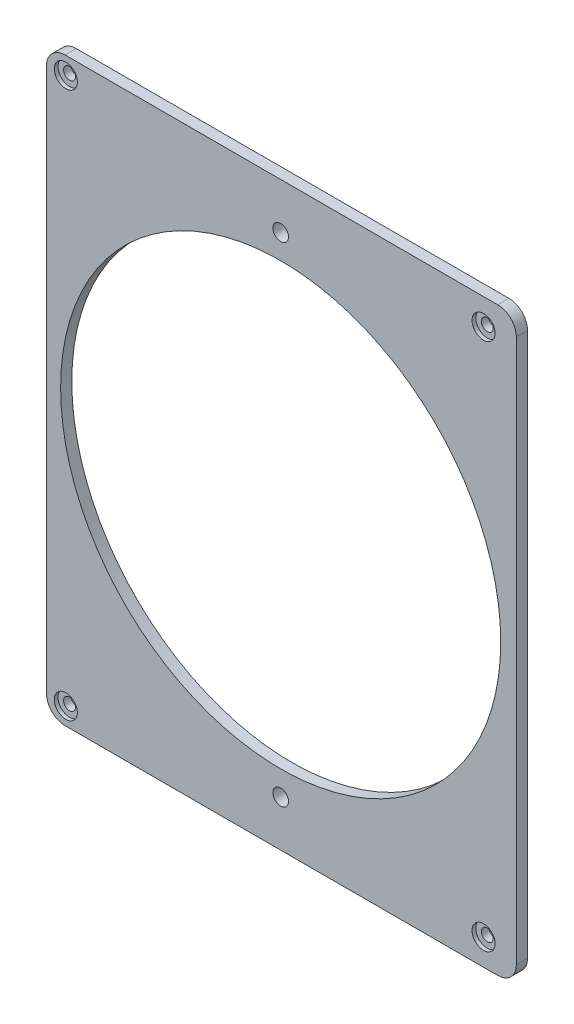
ISO-10303-21;
HEADER;
FILE_DESCRIPTION(('STEP AP214'),'2;1');
FILE_NAME('part.step','',(''),(''),'','','');
FILE_SCHEMA(('AUTOMOTIVE_DESIGN { 1 0 10303 214 1 1 1 1 }'));
ENDSEC;
DATA;
#1=APPLICATION_CONTEXT('core data for automotive mechanical design processes');
#2=APPLICATION_PROTOCOL_DEFINITION('international standard','automotive_design',2000,#1);
#3=PRODUCT_CONTEXT('',#1,'mechanical');
#4=PRODUCT('Part','Part','',(#3));
#5=PRODUCT_RELATED_PRODUCT_CATEGORY('part','',(#4));
#6=PRODUCT_DEFINITION_FORMATION('','',#4);
#7=PRODUCT_DEFINITION_CONTEXT('part definition',#1,'design');
#8=PRODUCT_DEFINITION('design','',#6,#7);
#9=PRODUCT_DEFINITION_SHAPE('','',#8);
#10=(LENGTH_UNIT() NAMED_UNIT(*) SI_UNIT(.MILLI.,.METRE.));
#11=(NAMED_UNIT(*) PLANE_ANGLE_UNIT() SI_UNIT($,.RADIAN.));
#12=(NAMED_UNIT(*) SI_UNIT($,.STERADIAN.) SOLID_ANGLE_UNIT());
#13=UNCERTAINTY_MEASURE_WITH_UNIT(LENGTH_MEASURE(1.E-05),#10,'distance_accuracy_value','');
#14=(GEOMETRIC_REPRESENTATION_CONTEXT(3) GLOBAL_UNCERTAINTY_ASSIGNED_CONTEXT((#13)) GLOBAL_UNIT_ASSIGNED_CONTEXT((#10,
#11,#12)) REPRESENTATION_CONTEXT('',''));
#15=CARTESIAN_POINT('',(0.,0.,0.));
#16=DIRECTION('',(0.,0.,1.));
#17=DIRECTION('',(1.,0.,0.));
#18=AXIS2_PLACEMENT_3D('',#15,#16,#17);
#19=CARTESIAN_POINT('',(58.4934425788602,-70.9643370582062,3.));
#20=DIRECTION('',(0.,0.,-1.));
#21=DIRECTION('',(-1.,0.,0.));
#22=AXIS2_PLACEMENT_3D('',#19,#20,#21);
#23=CYLINDRICAL_SURFACE('',#22,1.59999999999802);
#24=CARTESIAN_POINT('',(58.4934425788602,-70.9643370582062,0.));
#25=DIRECTION('',(0.,0.,1.));
#26=DIRECTION('',(-1.,0.,0.));
#27=AXIS2_PLACEMENT_3D('',#24,#25,#26);
#28=CIRCLE('',#27,1.59999999999802);
#29=CARTESIAN_POINT('',(56.8934425788622,-70.9643370582062,0.));
#30=VERTEX_POINT('',#29);
#31=EDGE_CURVE('E231',#30,#30,#28,.T.);
#32=ORIENTED_EDGE('',*,*,#31,.F.);
#33=EDGE_LOOP('',(#32));
#34=FACE_BOUND('',#33,.T.);
#35=CARTESIAN_POINT('',(58.4934425788602,-70.9643370582062,2.));
#36=DIRECTION('',(0.,0.,1.));
#37=DIRECTION('',(1.,0.,0.));
#38=AXIS2_PLACEMENT_3D('',#35,#36,#37);
#39=CIRCLE('',#38,1.59999999999802);
#40=CARTESIAN_POINT('',(60.0934425788583,-70.9643370582062,2.));
#41=VERTEX_POINT('',#40);
#42=EDGE_CURVE('E197',#41,#41,#39,.T.);
#43=ORIENTED_EDGE('',*,*,#42,.T.);
#44=EDGE_LOOP('',(#43));
#45=FACE_BOUND('',#44,.T.);
#46=ADVANCED_FACE('F43',(#34,#45),#23,.F.);
#47=CARTESIAN_POINT('',(-53.7050082180734,-73.3482193616655,3.));
#48=DIRECTION('',(0.,0.,-1.));
#49=DIRECTION('',(-1.,0.,0.));
#50=AXIS2_PLACEMENT_3D('',#47,#48,#49);
#51=CYLINDRICAL_SURFACE('',#50,1.59999999999705);
#52=CARTESIAN_POINT('',(-53.7050082180734,-73.3482193616655,0.));
#53=DIRECTION('',(0.,0.,1.));
#54=DIRECTION('',(-1.,0.,0.));
#55=AXIS2_PLACEMENT_3D('',#52,#53,#54);
#56=CIRCLE('',#55,1.59999999999705);
#57=CARTESIAN_POINT('',(-55.3050082180705,-73.3482193616655,0.));
#58=VERTEX_POINT('',#57);
#59=EDGE_CURVE('E222',#58,#58,#56,.T.);
#60=ORIENTED_EDGE('',*,*,#59,.F.);
#61=EDGE_LOOP('',(#60));
#62=FACE_BOUND('',#61,.T.);
#63=CARTESIAN_POINT('',(-53.7050082180734,-73.3482193616655,2.));
#64=DIRECTION('',(0.,0.,1.));
#65=DIRECTION('',(1.,0.,0.));
#66=AXIS2_PLACEMENT_3D('',#63,#64,#65);
#67=CIRCLE('',#66,1.59999999999705);
#68=CARTESIAN_POINT('',(-52.1050082180764,-73.3482193616655,2.));
#69=VERTEX_POINT('',#68);
#70=EDGE_CURVE('E189',#69,#69,#67,.T.);
#71=ORIENTED_EDGE('',*,*,#70,.T.);
#72=EDGE_LOOP('',(#71));
#73=FACE_BOUND('',#72,.T.);
#74=ADVANCED_FACE('F293',(#62,#73),#51,.F.);
#75=CARTESIAN_POINT('',(62.2999999999999,-72.9999999999999,3.));
#76=DIRECTION('',(0.,0.,-1.));
#77=DIRECTION('',(-1.,0.,0.));
#78=AXIS2_PLACEMENT_3D('',#75,#76,#77);
#79=PLANE('',#78);
#80=CARTESIAN_POINT('',(58.4934425788602,70.9643370582062,3.));
#81=DIRECTION('',(0.,0.,1.));
#82=DIRECTION('',(-1.,0.,0.));
#83=AXIS2_PLACEMENT_3D('',#80,#81,#82);
#84=CIRCLE('',#83,3.10000000001108);
#85=CARTESIAN_POINT('',(55.3934425788491,70.9643370582062,3.));
#86=VERTEX_POINT('',#85);
#87=EDGE_CURVE('E259',#86,#86,#84,.T.);
#88=ORIENTED_EDGE('',*,*,#87,.F.);
#89=EDGE_LOOP('',(#88));
#90=FACE_BOUND('',#89,.T.);
#91=CARTESIAN_POINT('',(-53.7050082180734,73.3482193616655,3.));
#92=DIRECTION('',(0.,0.,1.));
#93=DIRECTION('',(-1.,0.,0.));
#94=AXIS2_PLACEMENT_3D('',#91,#92,#93);
#95=CIRCLE('',#94,3.10000000000686);
#96=CARTESIAN_POINT('',(-56.8050082180803,73.3482193616655,3.));
#97=VERTEX_POINT('',#96);
#98=EDGE_CURVE('E264',#97,#97,#95,.T.);
#99=ORIENTED_EDGE('',*,*,#98,.F.);
#100=EDGE_LOOP('',(#99));
#101=FACE_BOUND('',#100,.T.);
#102=CARTESIAN_POINT('',(-53.7050082180734,-73.3482193616655,3.));
#103=DIRECTION('',(0.,0.,1.));
#104=DIRECTION('',(1.,0.,0.));
#105=AXIS2_PLACEMENT_3D('',#102,#103,#104);
#106=CIRCLE('',#105,3.1);
#107=CARTESIAN_POINT('',(-50.6050082180734,-73.3482193616655,3.));
#108=VERTEX_POINT('',#107);
#109=EDGE_CURVE('E272',#108,#108,#106,.T.);
#110=ORIENTED_EDGE('',*,*,#109,.F.);
#111=EDGE_LOOP('',(#110));
#112=FACE_BOUND('',#111,.T.);
#113=CARTESIAN_POINT('',(58.4934425788602,-70.9643370582062,3.));
#114=DIRECTION('',(0.,0.,1.));
#115=DIRECTION('',(1.,0.,0.));
#116=AXIS2_PLACEMENT_3D('',#113,#114,#115);
#117=CIRCLE('',#116,3.1);
#118=CARTESIAN_POINT('',(61.5934425788602,-70.9643370582062,3.));
#119=VERTEX_POINT('',#118);
#120=EDGE_CURVE('E270',#119,#119,#117,.T.);
#121=ORIENTED_EDGE('',*,*,#120,.F.);
#122=EDGE_LOOP('',(#121));
#123=FACE_BOUND('',#122,.T.);
#124=CARTESIAN_POINT('',(3.99999999999862,-65.6499999999991,3.));
#125=DIRECTION('',(0.,0.,1.));
#126=DIRECTION('',(1.,0.,0.));
#127=AXIS2_PLACEMENT_3D('',#124,#125,#126);
#128=CIRCLE('',#127,2.1);
#129=CARTESIAN_POINT('',(6.09999999999862,-65.6499999999991,3.));
#130=VERTEX_POINT('',#129);
#131=EDGE_CURVE('E218',#130,#130,#128,.T.);
#132=ORIENTED_EDGE('',*,*,#131,.F.);
#133=EDGE_LOOP('',(#132));
#134=FACE_BOUND('',#133,.T.);
#135=CARTESIAN_POINT('',(3.99999999999801,65.6500000000009,3.));
#136=DIRECTION('',(0.,0.,1.));
#137=DIRECTION('',(1.,0.,0.));
#138=AXIS2_PLACEMENT_3D('',#135,#136,#137);
#139=CIRCLE('',#138,2.1);
#140=CARTESIAN_POINT('',(6.099999999998,65.6500000000009,3.));
#141=VERTEX_POINT('',#140);
#142=EDGE_CURVE('E211',#141,#141,#139,.T.);
#143=ORIENTED_EDGE('',*,*,#142,.F.);
#144=EDGE_LOOP('',(#143));
#145=FACE_BOUND('',#144,.T.);
#146=CARTESIAN_POINT('',(62.2999999999999,-72.9999999999999,3.));
#147=DIRECTION('',(0.,0.,1.));
#148=DIRECTION('',(-1.,0.,0.));
#149=AXIS2_PLACEMENT_3D('',#146,#147,#148);
#150=CIRCLE('',#149,5.00000000000009);
#151=CARTESIAN_POINT('',(62.2999999999999,-78.0000000000001,3.));
#152=VERTEX_POINT('',#151);
#153=CARTESIAN_POINT('',(67.3,-72.9999999999951,3.));
#154=VERTEX_POINT('',#153);
#155=EDGE_CURVE('E172',#152,#154,#150,.T.);
#156=ORIENTED_EDGE('',*,*,#155,.T.);
#157=DIRECTION('',(0.,1.,0.));
#158=VECTOR('',#157,1.);
#159=CARTESIAN_POINT('',(67.3,-72.9999999999951,3.));
#160=LINE('',#159,#158);
#161=CARTESIAN_POINT('',(67.3,72.9999999999951,3.));
#162=VERTEX_POINT('',#161);
#163=EDGE_CURVE('E106',#154,#162,#160,.T.);
#164=ORIENTED_EDGE('',*,*,#163,.T.);
#165=CARTESIAN_POINT('',(62.2999999999999,72.9999999999951,3.));
#166=DIRECTION('',(0.,0.,1.));
#167=DIRECTION('',(1.,0.,0.));
#168=AXIS2_PLACEMENT_3D('',#165,#166,#167);
#169=CIRCLE('',#168,5.00000000000002);
#170=CARTESIAN_POINT('',(62.2999999999999,77.9999999999951,3.));
#171=VERTEX_POINT('',#170);
#172=EDGE_CURVE('E249',#162,#171,#169,.T.);
#173=ORIENTED_EDGE('',*,*,#172,.T.);
#174=DIRECTION('',(-1.,0.,0.));
#175=VECTOR('',#174,1.);
#176=CARTESIAN_POINT('',(62.2999999999999,77.9999999999951,3.));
#177=LINE('',#176,#175);
#178=CARTESIAN_POINT('',(-53.9000000000051,77.9999999999951,3.));
#179=VERTEX_POINT('',#178);
#180=EDGE_CURVE('E252',#171,#179,#177,.T.);
#181=ORIENTED_EDGE('',*,*,#180,.T.);
#182=CARTESIAN_POINT('',(-53.9000000000051,73.,3.));
#183=DIRECTION('',(0.,0.,1.));
#184=DIRECTION('',(1.,0.,0.));
#185=AXIS2_PLACEMENT_3D('',#182,#183,#184);
#186=CIRCLE('',#185,4.99999999999506);
#187=CARTESIAN_POINT('',(-58.9000000000001,73.,3.));
#188=VERTEX_POINT('',#187);
#189=EDGE_CURVE('E126',#179,#188,#186,.T.);
#190=ORIENTED_EDGE('',*,*,#189,.T.);
#191=DIRECTION('',(0.,-1.,0.));
#192=VECTOR('',#191,1.);
#193=CARTESIAN_POINT('',(-58.9000000000001,-73.,3.));
#194=LINE('',#193,#192);
#195=CARTESIAN_POINT('',(-58.9000000000001,-73.,3.));
#196=VERTEX_POINT('',#195);
#197=EDGE_CURVE('E119',#188,#196,#194,.T.);
#198=ORIENTED_EDGE('',*,*,#197,.T.);
#199=CARTESIAN_POINT('',(-53.9,-73.,3.));
#200=DIRECTION('',(0.,0.,1.));
#201=DIRECTION('',(-1.,0.,0.));
#202=AXIS2_PLACEMENT_3D('',#199,#200,#201);
#203=CIRCLE('',#202,5.0000000000001);
#204=CARTESIAN_POINT('',(-53.9,-78.0000000000001,3.));
#205=VERTEX_POINT('',#204);
#206=EDGE_CURVE('E124',#196,#205,#203,.T.);
#207=ORIENTED_EDGE('',*,*,#206,.T.);
#208=DIRECTION('',(1.,0.,0.));
#209=VECTOR('',#208,1.);
#210=CARTESIAN_POINT('',(62.2999999999999,-78.0000000000001,3.));
#211=LINE('',#210,#209);
#212=EDGE_CURVE('E63',#205,#152,#211,.T.);
#213=ORIENTED_EDGE('',*,*,#212,.T.);
#214=EDGE_LOOP('',(#156,#164,#173,#181,#190,#198,#207,#213));
#215=FACE_BOUND('',#214,.T.);
#216=CARTESIAN_POINT('',(3.99999999999867,8.87431154202782E-13,3.));
#217=DIRECTION('',(0.,0.,1.));
#218=DIRECTION('',(1.,0.,0.));
#219=AXIS2_PLACEMENT_3D('',#216,#217,#218);
#220=CIRCLE('',#219,59.1);
#221=CARTESIAN_POINT('',(63.0999999999987,8.87431154202782E-13,3.));
#222=VERTEX_POINT('',#221);
#223=EDGE_CURVE('E154',#222,#222,#220,.T.);
#224=ORIENTED_EDGE('',*,*,#223,.F.);
#225=EDGE_LOOP('',(#224));
#226=FACE_BOUND('',#225,.T.);
#227=ADVANCED_FACE('F121',(#90,#101,#112,#123,#134,#145,#215,#226),#79,.F.);
#228=CARTESIAN_POINT('',(62.2999999999999,-72.9999999999999,0.));
#229=DIRECTION('',(0.,0.,-1.));
#230=DIRECTION('',(-1.,0.,0.));
#231=AXIS2_PLACEMENT_3D('',#228,#229,#230);
#232=PLANE('',#231);
#233=CARTESIAN_POINT('',(3.99999999999862,-65.6499999999991,0.));
#234=DIRECTION('',(0.,0.,1.));
#235=DIRECTION('',(1.,0.,0.));
#236=AXIS2_PLACEMENT_3D('',#233,#234,#235);
#237=CIRCLE('',#236,2.1);
#238=CARTESIAN_POINT('',(6.09999999999862,-65.6499999999991,0.));
#239=VERTEX_POINT('',#238);
#240=EDGE_CURVE('E227',#239,#239,#237,.T.);
#241=ORIENTED_EDGE('',*,*,#240,.T.);
#242=EDGE_LOOP('',(#241));
#243=FACE_BOUND('',#242,.T.);
#244=CARTESIAN_POINT('',(3.99999999999801,65.6500000000009,0.));
#245=DIRECTION('',(0.,0.,1.));
#246=DIRECTION('',(1.,0.,0.));
#247=AXIS2_PLACEMENT_3D('',#244,#245,#246);
#248=CIRCLE('',#247,2.1);
#249=CARTESIAN_POINT('',(6.099999999998,65.6500000000009,0.));
#250=VERTEX_POINT('',#249);
#251=EDGE_CURVE('E205',#250,#250,#248,.T.);
#252=ORIENTED_EDGE('',*,*,#251,.T.);
#253=EDGE_LOOP('',(#252));
#254=FACE_BOUND('',#253,.T.);
#255=CARTESIAN_POINT('',(-53.7050082180734,73.3482193616655,0.));
#256=DIRECTION('',(0.,0.,1.));
#257=DIRECTION('',(1.,0.,0.));
#258=AXIS2_PLACEMENT_3D('',#255,#256,#257);
#259=CIRCLE('',#258,1.6);
#260=CARTESIAN_POINT('',(-52.1050082180734,73.3482193616655,0.));
#261=VERTEX_POINT('',#260);
#262=EDGE_CURVE('E226',#261,#261,#259,.T.);
#263=ORIENTED_EDGE('',*,*,#262,.T.);
#264=EDGE_LOOP('',(#263));
#265=FACE_BOUND('',#264,.T.);
#266=CARTESIAN_POINT('',(58.4934425788602,70.9643370582062,0.));
#267=DIRECTION('',(0.,0.,1.));
#268=DIRECTION('',(1.,0.,0.));
#269=AXIS2_PLACEMENT_3D('',#266,#267,#268);
#270=CIRCLE('',#269,1.6);
#271=CARTESIAN_POINT('',(60.0934425788602,70.9643370582062,0.));
#272=VERTEX_POINT('',#271);
#273=EDGE_CURVE('E235',#272,#272,#270,.T.);
#274=ORIENTED_EDGE('',*,*,#273,.T.);
#275=EDGE_LOOP('',(#274));
#276=FACE_BOUND('',#275,.T.);
#277=CARTESIAN_POINT('',(62.2999999999999,-72.9999999999999,0.));
#278=DIRECTION('',(0.,0.,1.));
#279=DIRECTION('',(-1.,0.,0.));
#280=AXIS2_PLACEMENT_3D('',#277,#278,#279);
#281=CIRCLE('',#280,5.00000000000009);
#282=CARTESIAN_POINT('',(62.2999999999999,-78.0000000000001,0.));
#283=VERTEX_POINT('',#282);
#284=CARTESIAN_POINT('',(67.3,-72.9999999999951,0.));
#285=VERTEX_POINT('',#284);
#286=EDGE_CURVE('E149',#283,#285,#281,.T.);
#287=ORIENTED_EDGE('',*,*,#286,.F.);
#288=DIRECTION('',(1.,0.,0.));
#289=VECTOR('',#288,1.);
#290=CARTESIAN_POINT('',(62.2999999999999,-78.0000000000001,0.));
#291=LINE('',#290,#289);
#292=CARTESIAN_POINT('',(-53.9,-78.0000000000001,0.));
#293=VERTEX_POINT('',#292);
#294=EDGE_CURVE('E98',#293,#283,#291,.T.);
#295=ORIENTED_EDGE('',*,*,#294,.F.);
#296=CARTESIAN_POINT('',(-53.9,-73.,0.));
#297=DIRECTION('',(0.,0.,1.));
#298=DIRECTION('',(-1.,0.,0.));
#299=AXIS2_PLACEMENT_3D('',#296,#297,#298);
#300=CIRCLE('',#299,5.0000000000001);
#301=CARTESIAN_POINT('',(-58.9000000000001,-73.,0.));
#302=VERTEX_POINT('',#301);
#303=EDGE_CURVE('E92',#302,#293,#300,.T.);
#304=ORIENTED_EDGE('',*,*,#303,.F.);
#305=DIRECTION('',(0.,-1.,0.));
#306=VECTOR('',#305,1.);
#307=CARTESIAN_POINT('',(-58.9000000000001,-73.,0.));
#308=LINE('',#307,#306);
#309=CARTESIAN_POINT('',(-58.9000000000001,73.,0.));
#310=VERTEX_POINT('',#309);
#311=EDGE_CURVE('E135',#310,#302,#308,.T.);
#312=ORIENTED_EDGE('',*,*,#311,.F.);
#313=CARTESIAN_POINT('',(-53.9000000000051,73.,0.));
#314=DIRECTION('',(0.,0.,1.));
#315=DIRECTION('',(1.,0.,0.));
#316=AXIS2_PLACEMENT_3D('',#313,#314,#315);
#317=CIRCLE('',#316,4.99999999999506);
#318=CARTESIAN_POINT('',(-53.9000000000051,77.9999999999951,0.));
#319=VERTEX_POINT('',#318);
#320=EDGE_CURVE('E163',#319,#310,#317,.T.);
#321=ORIENTED_EDGE('',*,*,#320,.F.);
#322=DIRECTION('',(-1.,0.,0.));
#323=VECTOR('',#322,1.);
#324=CARTESIAN_POINT('',(62.2999999999999,77.9999999999951,0.));
#325=LINE('',#324,#323);
#326=CARTESIAN_POINT('',(62.2999999999999,77.9999999999951,0.));
#327=VERTEX_POINT('',#326);
#328=EDGE_CURVE('E160',#327,#319,#325,.T.);
#329=ORIENTED_EDGE('',*,*,#328,.F.);
#330=CARTESIAN_POINT('',(62.2999999999999,72.9999999999951,0.));
#331=DIRECTION('',(0.,0.,1.));
#332=DIRECTION('',(1.,0.,0.));
#333=AXIS2_PLACEMENT_3D('',#330,#331,#332);
#334=CIRCLE('',#333,5.00000000000002);
#335=CARTESIAN_POINT('',(67.3,72.9999999999951,0.));
#336=VERTEX_POINT('',#335);
#337=EDGE_CURVE('E157',#336,#327,#334,.T.);
#338=ORIENTED_EDGE('',*,*,#337,.F.);
#339=DIRECTION('',(0.,1.,0.));
#340=VECTOR('',#339,1.);
#341=CARTESIAN_POINT('',(67.3,-72.9999999999951,0.));
#342=LINE('',#341,#340);
#343=EDGE_CURVE('E153',#285,#336,#342,.T.);
#344=ORIENTED_EDGE('',*,*,#343,.F.);
#345=EDGE_LOOP('',(#287,#295,#304,#312,#321,#329,#338,#344));
#346=FACE_BOUND('',#345,.T.);
#347=CARTESIAN_POINT('',(3.99999999999867,8.87431154202782E-13,0.));
#348=DIRECTION('',(0.,0.,1.));
#349=DIRECTION('',(1.,0.,0.));
#350=AXIS2_PLACEMENT_3D('',#347,#348,#349);
#351=CIRCLE('',#350,59.1);
#352=CARTESIAN_POINT('',(63.0999999999987,8.87431154202782E-13,0.));
#353=VERTEX_POINT('',#352);
#354=EDGE_CURVE('E239',#353,#353,#351,.T.);
#355=ORIENTED_EDGE('',*,*,#354,.T.);
#356=EDGE_LOOP('',(#355));
#357=FACE_BOUND('',#356,.T.);
#358=ORIENTED_EDGE('',*,*,#31,.T.);
#359=EDGE_LOOP('',(#358));
#360=FACE_BOUND('',#359,.T.);
#361=ORIENTED_EDGE('',*,*,#59,.T.);
#362=EDGE_LOOP('',(#361));
#363=FACE_BOUND('',#362,.T.);
#364=ADVANCED_FACE('F292',(#243,#254,#265,#276,#346,#357,#360,#363),#232,.T.);
#365=CARTESIAN_POINT('',(62.2999999999999,-72.9999999999999,3.));
#366=DIRECTION('',(0.,0.,-1.));
#367=DIRECTION('',(-1.,0.,0.));
#368=AXIS2_PLACEMENT_3D('',#365,#366,#367);
#369=CYLINDRICAL_SURFACE('',#368,5.00000000000009);
#370=ORIENTED_EDGE('',*,*,#286,.T.);
#371=DIRECTION('',(0.,0.,-1.));
#372=VECTOR('',#371,1.);
#373=CARTESIAN_POINT('',(67.3,-72.9999999999951,3.));
#374=LINE('',#373,#372);
#375=EDGE_CURVE('E11',#154,#285,#374,.T.);
#376=ORIENTED_EDGE('',*,*,#375,.F.);
#377=ORIENTED_EDGE('',*,*,#155,.F.);
#378=DIRECTION('',(0.,0.,-1.));
#379=VECTOR('',#378,1.);
#380=CARTESIAN_POINT('',(62.2999999999999,-78.0000000000001,3.));
#381=LINE('',#380,#379);
#382=EDGE_CURVE('E145',#152,#283,#381,.T.);
#383=ORIENTED_EDGE('',*,*,#382,.T.);
#384=EDGE_LOOP('',(#370,#376,#377,#383));
#385=FACE_BOUND('',#384,.T.);
#386=ADVANCED_FACE('F45',(#385),#369,.T.);
#387=CARTESIAN_POINT('',(67.3,-72.9999999999951,3.));
#388=DIRECTION('',(-1.,0.,0.));
#389=DIRECTION('',(0.,-1.,0.));
#390=AXIS2_PLACEMENT_3D('',#387,#388,#389);
#391=PLANE('',#390);
#392=ORIENTED_EDGE('',*,*,#343,.T.);
#393=DIRECTION('',(0.,0.,-1.));
#394=VECTOR('',#393,1.);
#395=CARTESIAN_POINT('',(67.3,72.9999999999951,3.));
#396=LINE('',#395,#394);
#397=EDGE_CURVE('E54',#162,#336,#396,.T.);
#398=ORIENTED_EDGE('',*,*,#397,.F.);
#399=ORIENTED_EDGE('',*,*,#163,.F.);
#400=ORIENTED_EDGE('',*,*,#375,.T.);
#401=EDGE_LOOP('',(#392,#398,#399,#400));
#402=FACE_BOUND('',#401,.T.);
#403=ADVANCED_FACE('F348',(#402),#391,.F.);
#404=CARTESIAN_POINT('',(62.2999999999999,72.9999999999951,3.));
#405=DIRECTION('',(0.,0.,-1.));
#406=DIRECTION('',(-1.,0.,0.));
#407=AXIS2_PLACEMENT_3D('',#404,#405,#406);
#408=CYLINDRICAL_SURFACE('',#407,5.00000000000002);
#409=ORIENTED_EDGE('',*,*,#337,.T.);
#410=DIRECTION('',(0.,0.,-1.));
#411=VECTOR('',#410,1.);
#412=CARTESIAN_POINT('',(62.2999999999999,77.9999999999951,3.));
#413=LINE('',#412,#411);
#414=EDGE_CURVE('E183',#171,#327,#413,.T.);
#415=ORIENTED_EDGE('',*,*,#414,.F.);
#416=ORIENTED_EDGE('',*,*,#172,.F.);
#417=ORIENTED_EDGE('',*,*,#397,.T.);
#418=EDGE_LOOP('',(#409,#415,#416,#417));
#419=FACE_BOUND('',#418,.T.);
#420=ADVANCED_FACE('F345',(#419),#408,.T.);
#421=CARTESIAN_POINT('',(62.2999999999999,77.9999999999951,3.));
#422=DIRECTION('',(0.,-1.,0.));
#423=DIRECTION('',(1.,0.,0.));
#424=AXIS2_PLACEMENT_3D('',#421,#422,#423);
#425=PLANE('',#424);
#426=ORIENTED_EDGE('',*,*,#328,.T.);
#427=DIRECTION('',(0.,0.,-1.));
#428=VECTOR('',#427,1.);
#429=CARTESIAN_POINT('',(-53.9000000000051,77.9999999999951,3.));
#430=LINE('',#429,#428);
#431=EDGE_CURVE('E179',#179,#319,#430,.T.);
#432=ORIENTED_EDGE('',*,*,#431,.F.);
#433=ORIENTED_EDGE('',*,*,#180,.F.);
#434=ORIENTED_EDGE('',*,*,#414,.T.);
#435=EDGE_LOOP('',(#426,#432,#433,#434));
#436=FACE_BOUND('',#435,.T.);
#437=ADVANCED_FACE('F341',(#436),#425,.F.);
#438=CARTESIAN_POINT('',(-53.9000000000051,73.,3.));
#439=DIRECTION('',(0.,0.,-1.));
#440=DIRECTION('',(-1.,0.,0.));
#441=AXIS2_PLACEMENT_3D('',#438,#439,#440);
#442=CYLINDRICAL_SURFACE('',#441,4.99999999999506);
#443=ORIENTED_EDGE('',*,*,#320,.T.);
#444=DIRECTION('',(0.,0.,-1.));
#445=VECTOR('',#444,1.);
#446=CARTESIAN_POINT('',(-58.9000000000001,73.,3.));
#447=LINE('',#446,#445);
#448=EDGE_CURVE('E137',#188,#310,#447,.T.);
#449=ORIENTED_EDGE('',*,*,#448,.F.);
#450=ORIENTED_EDGE('',*,*,#189,.F.);
#451=ORIENTED_EDGE('',*,*,#431,.T.);
#452=EDGE_LOOP('',(#443,#449,#450,#451));
#453=FACE_BOUND('',#452,.T.);
#454=ADVANCED_FACE('F338',(#453),#442,.T.);
#455=CARTESIAN_POINT('',(-58.9000000000001,-73.,3.));
#456=DIRECTION('',(1.,0.,0.));
#457=DIRECTION('',(0.,0.,-1.));
#458=AXIS2_PLACEMENT_3D('',#455,#456,#457);
#459=PLANE('',#458);
#460=ORIENTED_EDGE('',*,*,#311,.T.);
#461=DIRECTION('',(0.,0.,-1.));
#462=VECTOR('',#461,1.);
#463=CARTESIAN_POINT('',(-58.9000000000001,-73.,3.));
#464=LINE('',#463,#462);
#465=EDGE_CURVE('E132',#196,#302,#464,.T.);
#466=ORIENTED_EDGE('',*,*,#465,.F.);
#467=ORIENTED_EDGE('',*,*,#197,.F.);
#468=ORIENTED_EDGE('',*,*,#448,.T.);
#469=EDGE_LOOP('',(#460,#466,#467,#468));
#470=FACE_BOUND('',#469,.T.);
#471=ADVANCED_FACE('F133',(#470),#459,.F.);
#472=CARTESIAN_POINT('',(-53.9,-73.,3.));
#473=DIRECTION('',(0.,0.,-1.));
#474=DIRECTION('',(-1.,0.,0.));
#475=AXIS2_PLACEMENT_3D('',#472,#473,#474);
#476=CYLINDRICAL_SURFACE('',#475,5.0000000000001);
#477=ORIENTED_EDGE('',*,*,#303,.T.);
#478=DIRECTION('',(0.,0.,-1.));
#479=VECTOR('',#478,1.);
#480=CARTESIAN_POINT('',(-53.9,-78.0000000000001,3.));
#481=LINE('',#480,#479);
#482=EDGE_CURVE('E138',#205,#293,#481,.T.);
#483=ORIENTED_EDGE('',*,*,#482,.F.);
#484=ORIENTED_EDGE('',*,*,#206,.F.);
#485=ORIENTED_EDGE('',*,*,#465,.T.);
#486=EDGE_LOOP('',(#477,#483,#484,#485));
#487=FACE_BOUND('',#486,.T.);
#488=ADVANCED_FACE('F140',(#487),#476,.T.);
#489=CARTESIAN_POINT('',(62.2999999999999,-78.0000000000001,3.));
#490=DIRECTION('',(0.,1.,0.));
#491=DIRECTION('',(-1.,0.,0.));
#492=AXIS2_PLACEMENT_3D('',#489,#490,#491);
#493=PLANE('',#492);
#494=ORIENTED_EDGE('',*,*,#294,.T.);
#495=ORIENTED_EDGE('',*,*,#382,.F.);
#496=ORIENTED_EDGE('',*,*,#212,.F.);
#497=ORIENTED_EDGE('',*,*,#482,.T.);
#498=EDGE_LOOP('',(#494,#495,#496,#497));
#499=FACE_BOUND('',#498,.T.);
#500=ADVANCED_FACE('F326',(#499),#493,.F.);
#501=CARTESIAN_POINT('',(3.99999999999867,8.87431154202782E-13,3.));
#502=DIRECTION('',(0.,0.,-1.));
#503=DIRECTION('',(-1.,0.,0.));
#504=AXIS2_PLACEMENT_3D('',#501,#502,#503);
#505=CYLINDRICAL_SURFACE('',#504,59.1);
#506=ORIENTED_EDGE('',*,*,#223,.T.);
#507=EDGE_LOOP('',(#506));
#508=FACE_BOUND('',#507,.T.);
#509=ORIENTED_EDGE('',*,*,#354,.F.);
#510=EDGE_LOOP('',(#509));
#511=FACE_BOUND('',#510,.T.);
#512=ADVANCED_FACE('F323',(#508,#511),#505,.F.);
#513=CARTESIAN_POINT('',(58.4934425788602,70.9643370582062,3.));
#514=DIRECTION('',(0.,0.,-1.));
#515=DIRECTION('',(-1.,0.,0.));
#516=AXIS2_PLACEMENT_3D('',#513,#514,#515);
#517=CYLINDRICAL_SURFACE('',#516,1.6);
#518=CARTESIAN_POINT('',(58.4934425788602,70.9643370582062,2.));
#519=DIRECTION('',(0.,0.,-1.));
#520=DIRECTION('',(-1.,0.,0.));
#521=AXIS2_PLACEMENT_3D('',#518,#519,#520);
#522=CIRCLE('',#521,1.6);
#523=CARTESIAN_POINT('',(56.8934425788602,70.9643370582062,2.));
#524=VERTEX_POINT('',#523);
#525=EDGE_CURVE('E47',#524,#524,#522,.T.);
#526=ORIENTED_EDGE('',*,*,#525,.F.);
#527=EDGE_LOOP('',(#526));
#528=FACE_BOUND('',#527,.T.);
#529=ORIENTED_EDGE('',*,*,#273,.F.);
#530=EDGE_LOOP('',(#529));
#531=FACE_BOUND('',#530,.T.);
#532=ADVANCED_FACE('F309',(#528,#531),#517,.F.);
#533=CARTESIAN_POINT('',(-53.7050082180734,73.3482193616655,3.));
#534=DIRECTION('',(0.,0.,-1.));
#535=DIRECTION('',(-1.,0.,0.));
#536=AXIS2_PLACEMENT_3D('',#533,#534,#535);
#537=CYLINDRICAL_SURFACE('',#536,1.6);
#538=CARTESIAN_POINT('',(-53.7050082180734,73.3482193616655,2.));
#539=DIRECTION('',(0.,0.,-1.));
#540=DIRECTION('',(-1.,0.,0.));
#541=AXIS2_PLACEMENT_3D('',#538,#539,#540);
#542=CIRCLE('',#541,1.6);
#543=CARTESIAN_POINT('',(-55.3050082180734,73.3482193616655,2.));
#544=VERTEX_POINT('',#543);
#545=EDGE_CURVE('E193',#544,#544,#542,.T.);
#546=ORIENTED_EDGE('',*,*,#545,.F.);
#547=EDGE_LOOP('',(#546));
#548=FACE_BOUND('',#547,.T.);
#549=ORIENTED_EDGE('',*,*,#262,.F.);
#550=EDGE_LOOP('',(#549));
#551=FACE_BOUND('',#550,.T.);
#552=ADVANCED_FACE('F300',(#548,#551),#537,.F.);
#553=CARTESIAN_POINT('',(3.99999999999801,65.6500000000009,0.));
#554=DIRECTION('',(0.,0.,1.));
#555=DIRECTION('',(1.,0.,0.));
#556=AXIS2_PLACEMENT_3D('',#553,#554,#555);
#557=CYLINDRICAL_SURFACE('',#556,2.1);
#558=ORIENTED_EDGE('',*,*,#251,.F.);
#559=EDGE_LOOP('',(#558));
#560=FACE_BOUND('',#559,.T.);
#561=ORIENTED_EDGE('',*,*,#142,.T.);
#562=EDGE_LOOP('',(#561));
#563=FACE_BOUND('',#562,.T.);
#564=ADVANCED_FACE('F298',(#560,#563),#557,.F.);
#565=CARTESIAN_POINT('',(3.99999999999862,-65.6499999999991,0.));
#566=DIRECTION('',(0.,0.,1.));
#567=DIRECTION('',(1.,0.,0.));
#568=AXIS2_PLACEMENT_3D('',#565,#566,#567);
#569=CYLINDRICAL_SURFACE('',#568,2.1);
#570=ORIENTED_EDGE('',*,*,#240,.F.);
#571=EDGE_LOOP('',(#570));
#572=FACE_BOUND('',#571,.T.);
#573=ORIENTED_EDGE('',*,*,#131,.T.);
#574=EDGE_LOOP('',(#573));
#575=FACE_BOUND('',#574,.T.);
#576=ADVANCED_FACE('F288',(#572,#575),#569,.F.);
#577=CARTESIAN_POINT('',(-53.7050082180734,-73.3482193616655,2.));
#578=DIRECTION('',(0.,0.,1.));
#579=DIRECTION('',(1.,0.,0.));
#580=AXIS2_PLACEMENT_3D('',#577,#578,#579);
#581=CYLINDRICAL_SURFACE('',#580,3.1);
#582=CARTESIAN_POINT('',(-53.7050082180734,-73.3482193616655,2.));
#583=DIRECTION('',(0.,0.,1.));
#584=DIRECTION('',(1.,0.,0.));
#585=AXIS2_PLACEMENT_3D('',#582,#583,#584);
#586=CIRCLE('',#585,3.1);
#587=CARTESIAN_POINT('',(-50.6050082180734,-73.3482193616655,2.));
#588=VERTEX_POINT('',#587);
#589=EDGE_CURVE('E267',#588,#588,#586,.T.);
#590=ORIENTED_EDGE('',*,*,#589,.F.);
#591=EDGE_LOOP('',(#590));
#592=FACE_BOUND('',#591,.T.);
#593=ORIENTED_EDGE('',*,*,#109,.T.);
#594=EDGE_LOOP('',(#593));
#595=FACE_BOUND('',#594,.T.);
#596=ADVANCED_FACE('F306',(#592,#595),#581,.F.);
#597=CARTESIAN_POINT('',(-53.7050082180734,-73.3482193616655,2.));
#598=DIRECTION('',(0.,0.,1.));
#599=DIRECTION('',(1.,0.,0.));
#600=AXIS2_PLACEMENT_3D('',#597,#598,#599);
#601=PLANE('',#600);
#602=ORIENTED_EDGE('',*,*,#70,.F.);
#603=EDGE_LOOP('',(#602));
#604=FACE_BOUND('',#603,.T.);
#605=ORIENTED_EDGE('',*,*,#589,.T.);
#606=EDGE_LOOP('',(#605));
#607=FACE_BOUND('',#606,.T.);
#608=ADVANCED_FACE('F373',(#604,#607),#601,.T.);
#609=CARTESIAN_POINT('',(-53.7050082180734,73.3482193616655,2.));
#610=DIRECTION('',(0.,0.,1.));
#611=DIRECTION('',(1.,0.,0.));
#612=AXIS2_PLACEMENT_3D('',#609,#610,#611);
#613=CYLINDRICAL_SURFACE('',#612,3.10000000000686);
#614=CARTESIAN_POINT('',(-53.7050082180734,73.3482193616655,2.));
#615=DIRECTION('',(0.,0.,1.));
#616=DIRECTION('',(-1.,0.,0.));
#617=AXIS2_PLACEMENT_3D('',#614,#615,#616);
#618=CIRCLE('',#617,3.10000000000686);
#619=CARTESIAN_POINT('',(-56.8050082180803,73.3482193616655,2.));
#620=VERTEX_POINT('',#619);
#621=EDGE_CURVE('E261',#620,#620,#618,.T.);
#622=ORIENTED_EDGE('',*,*,#621,.F.);
#623=EDGE_LOOP('',(#622));
#624=FACE_BOUND('',#623,.T.);
#625=ORIENTED_EDGE('',*,*,#98,.T.);
#626=EDGE_LOOP('',(#625));
#627=FACE_BOUND('',#626,.T.);
#628=ADVANCED_FACE('F376',(#624,#627),#613,.F.);
#629=CARTESIAN_POINT('',(-53.7050082180734,73.3482193616655,2.));
#630=DIRECTION('',(0.,0.,-1.));
#631=DIRECTION('',(-1.,0.,0.));
#632=AXIS2_PLACEMENT_3D('',#629,#630,#631);
#633=PLANE('',#632);
#634=ORIENTED_EDGE('',*,*,#545,.T.);
#635=EDGE_LOOP('',(#634));
#636=FACE_BOUND('',#635,.T.);
#637=ORIENTED_EDGE('',*,*,#621,.T.);
#638=EDGE_LOOP('',(#637));
#639=FACE_BOUND('',#638,.T.);
#640=ADVANCED_FACE('F400',(#636,#639),#633,.F.);
#641=CARTESIAN_POINT('',(58.4934425788602,-70.9643370582062,2.));
#642=DIRECTION('',(0.,0.,1.));
#643=DIRECTION('',(1.,0.,0.));
#644=AXIS2_PLACEMENT_3D('',#641,#642,#643);
#645=CYLINDRICAL_SURFACE('',#644,3.1);
#646=CARTESIAN_POINT('',(58.4934425788602,-70.9643370582062,2.));
#647=DIRECTION('',(0.,0.,1.));
#648=DIRECTION('',(1.,0.,0.));
#649=AXIS2_PLACEMENT_3D('',#646,#647,#648);
#650=CIRCLE('',#649,3.1);
#651=CARTESIAN_POINT('',(61.5934425788602,-70.9643370582062,2.));
#652=VERTEX_POINT('',#651);
#653=EDGE_CURVE('E194',#652,#652,#650,.T.);
#654=ORIENTED_EDGE('',*,*,#653,.F.);
#655=EDGE_LOOP('',(#654));
#656=FACE_BOUND('',#655,.T.);
#657=ORIENTED_EDGE('',*,*,#120,.T.);
#658=EDGE_LOOP('',(#657));
#659=FACE_BOUND('',#658,.T.);
#660=ADVANCED_FACE('F404',(#656,#659),#645,.F.);
#661=CARTESIAN_POINT('',(58.4934425788602,-70.9643370582062,2.));
#662=DIRECTION('',(0.,0.,1.));
#663=DIRECTION('',(1.,0.,0.));
#664=AXIS2_PLACEMENT_3D('',#661,#662,#663);
#665=PLANE('',#664);
#666=ORIENTED_EDGE('',*,*,#42,.F.);
#667=EDGE_LOOP('',(#666));
#668=FACE_BOUND('',#667,.T.);
#669=ORIENTED_EDGE('',*,*,#653,.T.);
#670=EDGE_LOOP('',(#669));
#671=FACE_BOUND('',#670,.T.);
#672=ADVANCED_FACE('F409',(#668,#671),#665,.T.);
#673=CARTESIAN_POINT('',(58.4934425788602,70.9643370582062,2.));
#674=DIRECTION('',(0.,0.,1.));
#675=DIRECTION('',(1.,0.,0.));
#676=AXIS2_PLACEMENT_3D('',#673,#674,#675);
#677=CYLINDRICAL_SURFACE('',#676,3.10000000001108);
#678=CARTESIAN_POINT('',(58.4934425788602,70.9643370582062,2.));
#679=DIRECTION('',(0.,0.,1.));
#680=DIRECTION('',(-1.,0.,0.));
#681=AXIS2_PLACEMENT_3D('',#678,#679,#680);
#682=CIRCLE('',#681,3.10000000001108);
#683=CARTESIAN_POINT('',(55.3934425788491,70.9643370582062,2.));
#684=VERTEX_POINT('',#683);
#685=EDGE_CURVE('E256',#684,#684,#682,.T.);
#686=ORIENTED_EDGE('',*,*,#685,.F.);
#687=EDGE_LOOP('',(#686));
#688=FACE_BOUND('',#687,.T.);
#689=ORIENTED_EDGE('',*,*,#87,.T.);
#690=EDGE_LOOP('',(#689));
#691=FACE_BOUND('',#690,.T.);
#692=ADVANCED_FACE('F387',(#688,#691),#677,.F.);
#693=CARTESIAN_POINT('',(58.4934425788602,70.9643370582062,2.));
#694=DIRECTION('',(0.,0.,-1.));
#695=DIRECTION('',(-1.,0.,0.));
#696=AXIS2_PLACEMENT_3D('',#693,#694,#695);
#697=PLANE('',#696);
#698=ORIENTED_EDGE('',*,*,#525,.T.);
#699=EDGE_LOOP('',(#698));
#700=FACE_BOUND('',#699,.T.);
#701=ORIENTED_EDGE('',*,*,#685,.T.);
#702=EDGE_LOOP('',(#701));
#703=FACE_BOUND('',#702,.T.);
#704=ADVANCED_FACE('F408',(#700,#703),#697,.F.);
#705=CLOSED_SHELL('',(#46,#74,#227,#364,#386,#403,#420,#437,#454,#471,#488,#500,#512,#532,#552,
#564,#576,#596,#608,#628,#640,#660,#672,#692,#704));
#706=MANIFOLD_SOLID_BREP('B2',#705);
#707=ADVANCED_BREP_SHAPE_REPRESENTATION('',(#18,#706),#14);
#708=SHAPE_DEFINITION_REPRESENTATION(#9,#707);
ENDSEC;
END-ISO-10303-21;
